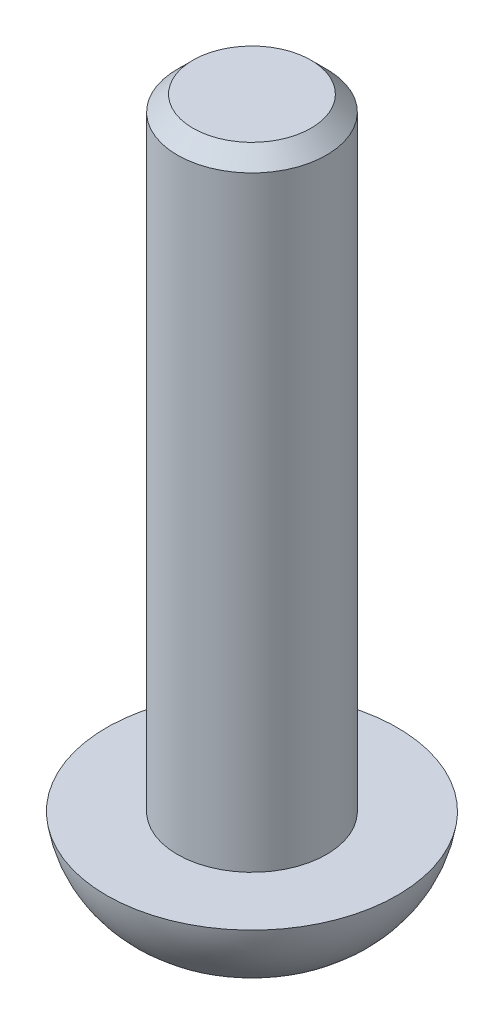
ISO-10303-21;
HEADER;
FILE_DESCRIPTION(('STEP AP214'),'2;1');
FILE_NAME('part.step','',(''),(''),'','','');
FILE_SCHEMA(('AUTOMOTIVE_DESIGN { 1 0 10303 214 1 1 1 1 }'));
ENDSEC;
DATA;
#1=APPLICATION_CONTEXT('core data for automotive mechanical design processes');
#2=APPLICATION_PROTOCOL_DEFINITION('international standard','automotive_design',2000,#1);
#3=PRODUCT_CONTEXT('',#1,'mechanical');
#4=PRODUCT('Part','Part','',(#3));
#5=PRODUCT_RELATED_PRODUCT_CATEGORY('part','',(#4));
#6=PRODUCT_DEFINITION_FORMATION('','',#4);
#7=PRODUCT_DEFINITION_CONTEXT('part definition',#1,'design');
#8=PRODUCT_DEFINITION('design','',#6,#7);
#9=PRODUCT_DEFINITION_SHAPE('','',#8);
#10=(LENGTH_UNIT() NAMED_UNIT(*) SI_UNIT(.MILLI.,.METRE.));
#11=(NAMED_UNIT(*) PLANE_ANGLE_UNIT() SI_UNIT($,.RADIAN.));
#12=(NAMED_UNIT(*) SI_UNIT($,.STERADIAN.) SOLID_ANGLE_UNIT());
#13=UNCERTAINTY_MEASURE_WITH_UNIT(LENGTH_MEASURE(1.E-05),#10,'distance_accuracy_value','');
#14=(GEOMETRIC_REPRESENTATION_CONTEXT(3) GLOBAL_UNCERTAINTY_ASSIGNED_CONTEXT((#13)) GLOBAL_UNIT_ASSIGNED_CONTEXT((#10,
#11,#12)) REPRESENTATION_CONTEXT('',''));
#15=CARTESIAN_POINT('',(0.,0.,0.));
#16=DIRECTION('',(0.,0.,1.));
#17=DIRECTION('',(1.,0.,0.));
#18=AXIS2_PLACEMENT_3D('',#15,#16,#17);
#19=CARTESIAN_POINT('',(0.,3.,0.));
#20=DIRECTION('',(0.,1.,0.));
#21=DIRECTION('',(0.,0.,1.));
#22=AXIS2_PLACEMENT_3D('',#19,#20,#21);
#23=PLANE('',#22);
#24=CARTESIAN_POINT('',(0.,3.,0.));
#25=DIRECTION('',(0.,1.,0.));
#26=DIRECTION('',(0.,0.,1.));
#27=AXIS2_PLACEMENT_3D('',#24,#25,#26);
#28=CIRCLE('',#27,2.4);
#29=CARTESIAN_POINT('',(0.,3.,2.4));
#30=VERTEX_POINT('',#29);
#31=EDGE_CURVE('E126',#30,#30,#28,.T.);
#32=ORIENTED_EDGE('',*,*,#31,.F.);
#33=EDGE_LOOP('',(#32));
#34=FACE_BOUND('',#33,.T.);
#35=CARTESIAN_POINT('',(0.,3.,0.));
#36=DIRECTION('',(0.,1.,0.));
#37=DIRECTION('',(0.,0.,1.));
#38=AXIS2_PLACEMENT_3D('',#35,#36,#37);
#39=CIRCLE('',#38,4.68);
#40=CARTESIAN_POINT('',(0.,3.,4.68));
#41=VERTEX_POINT('',#40);
#42=EDGE_CURVE('E138',#41,#41,#39,.T.);
#43=ORIENTED_EDGE('',*,*,#42,.T.);
#44=EDGE_LOOP('',(#43));
#45=FACE_BOUND('',#44,.T.);
#46=ADVANCED_FACE('F34',(#34,#45),#23,.T.);
#47=CARTESIAN_POINT('',(0.,3.,0.));
#48=DIRECTION('',(0.,1.,0.));
#49=DIRECTION('',(0.,0.,1.));
#50=AXIS2_PLACEMENT_3D('',#47,#48,#49);
#51=CYLINDRICAL_SURFACE('',#50,2.4);
#52=CARTESIAN_POINT('',(0.,22.5,0.));
#53=DIRECTION('',(0.,1.,0.));
#54=DIRECTION('',(0.,0.,1.));
#55=AXIS2_PLACEMENT_3D('',#52,#53,#54);
#56=CIRCLE('',#55,2.4);
#57=CARTESIAN_POINT('',(0.,22.5,2.4));
#58=VERTEX_POINT('',#57);
#59=EDGE_CURVE('E144',#58,#58,#56,.F.);
#60=ORIENTED_EDGE('',*,*,#59,.T.);
#61=EDGE_LOOP('',(#60));
#62=FACE_BOUND('',#61,.T.);
#63=ORIENTED_EDGE('',*,*,#31,.T.);
#64=EDGE_LOOP('',(#63));
#65=FACE_BOUND('',#64,.T.);
#66=ADVANCED_FACE('F175',(#62,#65),#51,.T.);
#67=CARTESIAN_POINT('',(0.,23.,0.));
#68=DIRECTION('',(0.,1.,0.));
#69=DIRECTION('',(0.,0.,1.));
#70=AXIS2_PLACEMENT_3D('',#67,#68,#69);
#71=PLANE('',#70);
#72=CARTESIAN_POINT('',(0.,23.,0.));
#73=DIRECTION('',(0.,1.,0.));
#74=DIRECTION('',(0.,0.,1.));
#75=AXIS2_PLACEMENT_3D('',#72,#73,#74);
#76=CIRCLE('',#75,1.9);
#77=CARTESIAN_POINT('',(0.,23.,1.9));
#78=VERTEX_POINT('',#77);
#79=EDGE_CURVE('E141',#78,#78,#76,.T.);
#80=ORIENTED_EDGE('',*,*,#79,.T.);
#81=EDGE_LOOP('',(#80));
#82=FACE_BOUND('',#81,.T.);
#83=ADVANCED_FACE('F206',(#82),#71,.T.);
#84=CARTESIAN_POINT('',(0.,23.,0.));
#85=DIRECTION('',(0.,-1.,0.));
#86=DIRECTION('',(0.,0.,-1.));
#87=AXIS2_PLACEMENT_3D('',#84,#85,#86);
#88=CONICAL_SURFACE('',#87,1.9,0.785398163397445);
#89=ORIENTED_EDGE('',*,*,#59,.F.);
#90=EDGE_LOOP('',(#89));
#91=FACE_BOUND('',#90,.T.);
#92=ORIENTED_EDGE('',*,*,#79,.F.);
#93=EDGE_LOOP('',(#92));
#94=FACE_BOUND('',#93,.T.);
#95=ADVANCED_FACE('F174',(#91,#94),#88,.T.);
#96=CARTESIAN_POINT('',(0.935307436087194,2.5,-1.62));
#97=DIRECTION('',(0.866025403784439,0.,-0.5));
#98=DIRECTION('',(-0.5,0.,-0.866025403784439));
#99=AXIS2_PLACEMENT_3D('',#96,#97,#98);
#100=PLANE('',#99);
#101=DIRECTION('',(0.,-1.,0.));
#102=VECTOR('',#101,1.);
#103=CARTESIAN_POINT('',(0.935307436087194,2.5,-1.62));
#104=LINE('',#103,#102);
#105=CARTESIAN_POINT('',(0.935307436087194,2.5,-1.62));
#106=VERTEX_POINT('',#105);
#107=CARTESIAN_POINT('',(0.935307436087194,0.0617815192687872,-1.62));
#108=VERTEX_POINT('',#107);
#109=EDGE_CURVE('E124',#106,#108,#104,.T.);
#110=ORIENTED_EDGE('',*,*,#109,.T.);
#111=CARTESIAN_POINT('',(0.935307436087194,0.0617815192687872,-1.62));
#112=CARTESIAN_POINT('',(0.974195463553861,0.0543833718086007,-1.5526439606216));
#113=CARTESIAN_POINT('',(1.01313994870139,0.0483391222089289,-1.48519013367146));
#114=CARTESIAN_POINT('',(1.09108807279113,0.0384835743096659,-1.35018002239335));
#115=CARTESIAN_POINT('',(1.13009168870199,0.0346715590583717,-1.28262377795684));
#116=CARTESIAN_POINT('',(1.20806450981189,0.0288063710982432,-1.14757089018501));
#117=CARTESIAN_POINT('',(1.24703366446266,0.0267502856976961,-1.08007433440187));
#118=CARTESIAN_POINT('',(1.32498892973964,0.0240502903275775,-0.945051854224628));
#119=CARTESIAN_POINT('',(1.36397504193522,0.0234065689754333,-0.877525927112314));
#120=CARTESIAN_POINT('',(1.44194726632636,0.0234065689754333,-0.742474072887686));
#121=CARTESIAN_POINT('',(1.48093337852194,0.0240502903275775,-0.674948145775372));
#122=CARTESIAN_POINT('',(1.55888864379892,0.0267502856976962,-0.539925665598129));
#123=CARTESIAN_POINT('',(1.59785779844969,0.0288063710982434,-0.472429109814986));
#124=CARTESIAN_POINT('',(1.67583061955959,0.0346715590583718,-0.33737622204316));
#125=CARTESIAN_POINT('',(1.71483423547045,0.0384835743096658,-0.269819977606651));
#126=CARTESIAN_POINT('',(1.79278235956019,0.0483391222089286,-0.134809866328539));
#127=CARTESIAN_POINT('',(1.83172684470772,0.0543833718086004,-0.0673560393783999));
#128=CARTESIAN_POINT('',(1.87061487217439,0.0617815192687874,0.));
#129=B_SPLINE_CURVE_WITH_KNOTS('',3,(#111,#112,#113,#114,#115,#116,#117,#118,#119,#120,#121,
#122,#123,#124,#125,#126,#127,#128),.UNSPECIFIED.,.F.,.F.,(4,2,2,2,2,2,2,2,4),(0.,
0.234346855618668,0.468618402091486,0.702500585883414,0.936414002112481,1.17032741834155,
1.40420960213348,1.6384811486063,1.87282800422496),.UNSPECIFIED.);
#130=CARTESIAN_POINT('',(1.87061487217439,0.0617815192687872,0.));
#131=VERTEX_POINT('',#130);
#132=EDGE_CURVE('E47',#108,#131,#129,.T.);
#133=ORIENTED_EDGE('',*,*,#132,.T.);
#134=DIRECTION('',(0.,-1.,0.));
#135=VECTOR('',#134,1.);
#136=CARTESIAN_POINT('',(1.87061487217439,2.5,0.));
#137=LINE('',#136,#135);
#138=CARTESIAN_POINT('',(1.87061487217439,2.5,0.));
#139=VERTEX_POINT('',#138);
#140=EDGE_CURVE('E92',#139,#131,#137,.T.);
#141=ORIENTED_EDGE('',*,*,#140,.F.);
#142=DIRECTION('',(0.5,0.,0.866025403784439));
#143=VECTOR('',#142,1.);
#144=CARTESIAN_POINT('',(0.935307436087194,2.5,-1.62));
#145=LINE('',#144,#143);
#146=EDGE_CURVE('E96',#106,#139,#145,.T.);
#147=ORIENTED_EDGE('',*,*,#146,.F.);
#148=EDGE_LOOP('',(#110,#133,#141,#147));
#149=FACE_BOUND('',#148,.T.);
#150=ADVANCED_FACE('F94',(#149),#100,.F.);
#151=CARTESIAN_POINT('',(-0.935307436087194,2.5,-1.62));
#152=DIRECTION('',(0.,0.,-1.));
#153=DIRECTION('',(-1.,0.,0.));
#154=AXIS2_PLACEMENT_3D('',#151,#152,#153);
#155=PLANE('',#154);
#156=DIRECTION('',(0.,-1.,0.));
#157=VECTOR('',#156,1.);
#158=CARTESIAN_POINT('',(-0.935307436087194,2.5,-1.62));
#159=LINE('',#158,#157);
#160=CARTESIAN_POINT('',(-0.935307436087194,2.5,-1.62));
#161=VERTEX_POINT('',#160);
#162=CARTESIAN_POINT('',(-0.935307436087194,0.0617815192687872,-1.62));
#163=VERTEX_POINT('',#162);
#164=EDGE_CURVE('E127',#161,#163,#159,.T.);
#165=ORIENTED_EDGE('',*,*,#164,.T.);
#166=CARTESIAN_POINT('',(-0.935307436087194,0.0617815192687872,-1.62));
#167=CARTESIAN_POINT('',(-0.857531381153861,0.0543833718086006,-1.62));
#168=CARTESIAN_POINT('',(-0.779642410858795,0.0483391222089289,-1.62));
#169=CARTESIAN_POINT('',(-0.623746162679316,0.0384835743096659,-1.62));
#170=CARTESIAN_POINT('',(-0.545738930857599,0.0346715590583716,-1.62));
#171=CARTESIAN_POINT('',(-0.389793288637799,0.0288063710982431,-1.62));
#172=CARTESIAN_POINT('',(-0.311854979336259,0.026750285697696,-1.62));
#173=CARTESIAN_POINT('',(-0.155944448782294,0.0240502903275773,-1.62));
#174=CARTESIAN_POINT('',(-0.0779722243911471,0.023406568975433,-1.62));
#175=CARTESIAN_POINT('',(0.0779722243911471,0.0234065689754332,-1.62));
#176=CARTESIAN_POINT('',(0.155944448782294,0.0240502903275777,-1.62));
#177=CARTESIAN_POINT('',(0.311854979336259,0.0267502856976964,-1.62));
#178=CARTESIAN_POINT('',(0.389793288637799,0.0288063710982432,-1.62));
#179=CARTESIAN_POINT('',(0.545738930857599,0.0346715590583715,-1.62));
#180=CARTESIAN_POINT('',(0.623746162679316,0.0384835743096658,-1.62));
#181=CARTESIAN_POINT('',(0.779642410858794,0.0483391222089289,-1.62));
#182=CARTESIAN_POINT('',(0.857531381153861,0.0543833718086007,-1.62));
#183=CARTESIAN_POINT('',(0.935307436087194,0.0617815192687871,-1.62));
#184=B_SPLINE_CURVE_WITH_KNOTS('',3,(#166,#167,#168,#169,#170,#171,#172,#173,#174,#175,#176,
#177,#178,#179,#180,#181,#182,#183),.UNSPECIFIED.,.F.,.F.,(4,2,2,2,2,2,2,2,4),(0.,
0.234346855618667,0.468618402091486,0.702500585883414,0.936414002112481,1.17032741834155,
1.40420960213348,1.6384811486063,1.87282800422496),.UNSPECIFIED.);
#185=EDGE_CURVE('E61',#163,#108,#184,.T.);
#186=ORIENTED_EDGE('',*,*,#185,.T.);
#187=ORIENTED_EDGE('',*,*,#109,.F.);
#188=DIRECTION('',(1.,0.,0.));
#189=VECTOR('',#188,1.);
#190=CARTESIAN_POINT('',(-0.935307436087194,2.5,-1.62));
#191=LINE('',#190,#189);
#192=EDGE_CURVE('E101',#161,#106,#191,.T.);
#193=ORIENTED_EDGE('',*,*,#192,.F.);
#194=EDGE_LOOP('',(#165,#186,#187,#193));
#195=FACE_BOUND('',#194,.T.);
#196=ADVANCED_FACE('F173',(#195),#155,.F.);
#197=CARTESIAN_POINT('',(-1.87061487217439,2.5,0.));
#198=DIRECTION('',(-0.866025403784439,0.,-0.5));
#199=DIRECTION('',(-0.5,0.,0.866025403784439));
#200=AXIS2_PLACEMENT_3D('',#197,#198,#199);
#201=PLANE('',#200);
#202=DIRECTION('',(0.,-1.,0.));
#203=VECTOR('',#202,1.);
#204=CARTESIAN_POINT('',(-1.87061487217439,2.5,0.));
#205=LINE('',#204,#203);
#206=CARTESIAN_POINT('',(-1.87061487217439,2.5,0.));
#207=VERTEX_POINT('',#206);
#208=CARTESIAN_POINT('',(-1.87061487217439,0.0617815192687872,0.));
#209=VERTEX_POINT('',#208);
#210=EDGE_CURVE('E129',#207,#209,#205,.T.);
#211=ORIENTED_EDGE('',*,*,#210,.T.);
#212=CARTESIAN_POINT('',(-1.87061487217439,0.0617815192687872,0.));
#213=CARTESIAN_POINT('',(-1.83172684470772,0.0543833718086006,-0.0673560393784007));
#214=CARTESIAN_POINT('',(-1.79278235956019,0.0483391222089288,-0.13480986632854));
#215=CARTESIAN_POINT('',(-1.71483423547045,0.0384835743096659,-0.269819977606651));
#216=CARTESIAN_POINT('',(-1.67583061955959,0.0346715590583716,-0.33737622204316));
#217=CARTESIAN_POINT('',(-1.59785779844969,0.0288063710982431,-0.472429109814987));
#218=CARTESIAN_POINT('',(-1.55888864379892,0.026750285697696,-0.539925665598129));
#219=CARTESIAN_POINT('',(-1.48093337852194,0.0240502903275774,-0.674948145775372));
#220=CARTESIAN_POINT('',(-1.44194726632636,0.0234065689754332,-0.742474072887686));
#221=CARTESIAN_POINT('',(-1.36397504193522,0.0234065689754332,-0.877525927112314));
#222=CARTESIAN_POINT('',(-1.32498892973964,0.0240502903275774,-0.945051854224628));
#223=CARTESIAN_POINT('',(-1.24703366446266,0.026750285697696,-1.08007433440187));
#224=CARTESIAN_POINT('',(-1.20806450981189,0.0288063710982432,-1.14757089018501));
#225=CARTESIAN_POINT('',(-1.13009168870199,0.0346715590583717,-1.28262377795684));
#226=CARTESIAN_POINT('',(-1.09108807279113,0.038483574309666,-1.35018002239335));
#227=CARTESIAN_POINT('',(-1.01313994870139,0.048339122208929,-1.48519013367146));
#228=CARTESIAN_POINT('',(-0.974195463553861,0.0543833718086008,-1.5526439606216));
#229=CARTESIAN_POINT('',(-0.935307436087194,0.0617815192687873,-1.62));
#230=B_SPLINE_CURVE_WITH_KNOTS('',3,(#212,#213,#214,#215,#216,#217,#218,#219,#220,#221,#222,
#223,#224,#225,#226,#227,#228,#229),.UNSPECIFIED.,.F.,.F.,(4,2,2,2,2,2,2,2,4),(0.,
0.234346855618667,0.468618402091485,0.702500585883414,0.936414002112481,1.17032741834155,
1.40420960213348,1.63848114860629,1.87282800422496),.UNSPECIFIED.);
#231=EDGE_CURVE('E186',#209,#163,#230,.T.);
#232=ORIENTED_EDGE('',*,*,#231,.T.);
#233=ORIENTED_EDGE('',*,*,#164,.F.);
#234=DIRECTION('',(0.5,0.,-0.866025403784439));
#235=VECTOR('',#234,1.);
#236=CARTESIAN_POINT('',(-1.87061487217439,2.5,0.));
#237=LINE('',#236,#235);
#238=EDGE_CURVE('E121',#207,#161,#237,.T.);
#239=ORIENTED_EDGE('',*,*,#238,.F.);
#240=EDGE_LOOP('',(#211,#232,#233,#239));
#241=FACE_BOUND('',#240,.T.);
#242=ADVANCED_FACE('F193',(#241),#201,.F.);
#243=CARTESIAN_POINT('',(-0.935307436087194,2.5,1.62));
#244=DIRECTION('',(-0.866025403784439,0.,0.5));
#245=DIRECTION('',(0.5,0.,0.866025403784439));
#246=AXIS2_PLACEMENT_3D('',#243,#244,#245);
#247=PLANE('',#246);
#248=DIRECTION('',(0.,-1.,0.));
#249=VECTOR('',#248,1.);
#250=CARTESIAN_POINT('',(-0.935307436087194,2.5,1.62));
#251=LINE('',#250,#249);
#252=CARTESIAN_POINT('',(-0.935307436087194,2.5,1.62));
#253=VERTEX_POINT('',#252);
#254=CARTESIAN_POINT('',(-0.935307436087194,0.0617815192687872,1.62));
#255=VERTEX_POINT('',#254);
#256=EDGE_CURVE('E132',#253,#255,#251,.T.);
#257=ORIENTED_EDGE('',*,*,#256,.T.);
#258=CARTESIAN_POINT('',(-0.935307436087194,0.0617815192687872,1.62));
#259=CARTESIAN_POINT('',(-0.974195463553861,0.0543833718086006,1.5526439606216));
#260=CARTESIAN_POINT('',(-1.01313994870139,0.0483391222089289,1.48519013367146));
#261=CARTESIAN_POINT('',(-1.09108807279113,0.0384835743096658,1.35018002239335));
#262=CARTESIAN_POINT('',(-1.13009168870199,0.0346715590583716,1.28262377795684));
#263=CARTESIAN_POINT('',(-1.20806450981189,0.0288063710982431,1.14757089018501));
#264=CARTESIAN_POINT('',(-1.24703366446266,0.026750285697696,1.08007433440187));
#265=CARTESIAN_POINT('',(-1.32498892973964,0.0240502903275773,0.945051854224628));
#266=CARTESIAN_POINT('',(-1.36397504193522,0.0234065689754332,0.877525927112314));
#267=CARTESIAN_POINT('',(-1.44194726632636,0.0234065689754332,0.742474072887686));
#268=CARTESIAN_POINT('',(-1.48093337852194,0.0240502903275773,0.674948145775371));
#269=CARTESIAN_POINT('',(-1.55888864379892,0.026750285697696,0.539925665598128));
#270=CARTESIAN_POINT('',(-1.59785779844969,0.0288063710982431,0.472429109814986));
#271=CARTESIAN_POINT('',(-1.67583061955959,0.0346715590583717,0.33737622204316));
#272=CARTESIAN_POINT('',(-1.71483423547045,0.0384835743096659,0.269819977606651));
#273=CARTESIAN_POINT('',(-1.79278235956019,0.0483391222089289,0.134809866328539));
#274=CARTESIAN_POINT('',(-1.83172684470772,0.0543833718086007,0.0673560393784001));
#275=CARTESIAN_POINT('',(-1.87061487217439,0.0617815192687872,0.));
#276=B_SPLINE_CURVE_WITH_KNOTS('',3,(#258,#259,#260,#261,#262,#263,#264,#265,#266,#267,#268,
#269,#270,#271,#272,#273,#274,#275),.UNSPECIFIED.,.F.,.F.,(4,2,2,2,2,2,2,2,4),(0.,
0.234346855618667,0.468618402091485,0.702500585883414,0.936414002112481,1.17032741834155,
1.40420960213348,1.6384811486063,1.87282800422496),.UNSPECIFIED.);
#277=EDGE_CURVE('E275',#255,#209,#276,.T.);
#278=ORIENTED_EDGE('',*,*,#277,.T.);
#279=ORIENTED_EDGE('',*,*,#210,.F.);
#280=DIRECTION('',(-0.5,0.,-0.866025403784439));
#281=VECTOR('',#280,1.);
#282=CARTESIAN_POINT('',(-0.935307436087194,2.5,1.62));
#283=LINE('',#282,#281);
#284=EDGE_CURVE('E118',#253,#207,#283,.T.);
#285=ORIENTED_EDGE('',*,*,#284,.F.);
#286=EDGE_LOOP('',(#257,#278,#279,#285));
#287=FACE_BOUND('',#286,.T.);
#288=ADVANCED_FACE('F162',(#287),#247,.F.);
#289=CARTESIAN_POINT('',(0.935307436087193,2.5,1.62));
#290=DIRECTION('',(0.,0.,1.));
#291=DIRECTION('',(1.,0.,0.));
#292=AXIS2_PLACEMENT_3D('',#289,#290,#291);
#293=PLANE('',#292);
#294=CARTESIAN_POINT('',(0.935307436087193,0.0617815192687872,1.62));
#295=CARTESIAN_POINT('',(0.859993195689798,0.0546139739732388,1.62));
#296=CARTESIAN_POINT('',(0.784571877400165,0.0487210802472018,1.62));
#297=CARTESIAN_POINT('',(0.633631470653708,0.0390445054310467,1.62));
#298=CARTESIAN_POINT('',(0.558112453693214,0.0352597260197356,1.62));
#299=CARTESIAN_POINT('',(0.407029286155618,0.0293533221932797,1.62));
#300=CARTESIAN_POINT('',(0.33146514747901,0.0272313685467345,1.62));
#301=CARTESIAN_POINT('',(0.180270640365965,0.0243678366561961,1.62));
#302=CARTESIAN_POINT('',(0.104640257908429,0.0236269751847356,1.62));
#303=CARTESIAN_POINT('',(0.0290129064890216,0.0234367741107168,1.62));
#304=B_SPLINE_CURVE_WITH_KNOTS('',3,(#294,#295,#296,#297,#298,#299,#300,#301,#302,#303),
.UNSPECIFIED.,.F.,.F.,(4,2,2,2,4),(0.,0.226932504884211,0.453746667763859,0.680515911189588,
0.907402812773406),.UNSPECIFIED.);
#305=CARTESIAN_POINT('',(0.935307436087193,0.0617815192687872,1.62));
#306=VERTEX_POINT('',#305);
#307=CARTESIAN_POINT('',(0.0290129064890167,0.0234367741107678,1.62));
#308=VERTEX_POINT('',#307);
#309=EDGE_CURVE('E147',#306,#308,#304,.T.);
#310=ORIENTED_EDGE('',*,*,#309,.T.);
#311=CARTESIAN_POINT('',(0.0290129064890167,0.0234367741107678,1.62));
#312=CARTESIAN_POINT('',(-0.0514512258165705,0.0233134233651439,1.62));
#313=CARTESIAN_POINT('',(-0.13192100630037,0.0237992581565071,1.62));
#314=CARTESIAN_POINT('',(-0.292790974225353,0.0262916923692295,1.62));
#315=CARTESIAN_POINT('',(-0.373191175401834,0.0282974399001469,1.62));
#316=CARTESIAN_POINT('',(-0.533949188344242,0.0341319257053814,1.62));
#317=CARTESIAN_POINT('',(-0.61430698669917,0.0379610694735424,1.62));
#318=CARTESIAN_POINT('',(-0.774918771597592,0.0479728188518649,1.62));
#319=CARTESIAN_POINT('',(-0.855172673937747,0.0541567517074734,1.62));
#320=CARTESIAN_POINT('',(-0.935307436087194,0.0617815192687873,1.62));
#321=B_SPLINE_CURVE_WITH_KNOTS('',3,(#311,#312,#313,#314,#315,#316,#317,#318,#319,#320),
.UNSPECIFIED.,.F.,.F.,(4,2,2,2,4),(0.,0.241396790450141,0.482658381260408,0.723973649821988,
0.965425134322768),.UNSPECIFIED.);
#322=EDGE_CURVE('E153',#308,#255,#321,.T.);
#323=ORIENTED_EDGE('',*,*,#322,.T.);
#324=ORIENTED_EDGE('',*,*,#256,.F.);
#325=DIRECTION('',(-1.,0.,0.));
#326=VECTOR('',#325,1.);
#327=CARTESIAN_POINT('',(0.935307436087193,2.5,1.62));
#328=LINE('',#327,#326);
#329=CARTESIAN_POINT('',(0.935307436087193,2.5,1.62));
#330=VERTEX_POINT('',#329);
#331=EDGE_CURVE('E110',#330,#253,#328,.T.);
#332=ORIENTED_EDGE('',*,*,#331,.F.);
#333=DIRECTION('',(0.,-1.,0.));
#334=VECTOR('',#333,1.);
#335=CARTESIAN_POINT('',(0.935307436087193,2.5,1.62));
#336=LINE('',#335,#334);
#337=EDGE_CURVE('E100',#330,#306,#336,.T.);
#338=ORIENTED_EDGE('',*,*,#337,.T.);
#339=EDGE_LOOP('',(#310,#323,#324,#332,#338));
#340=FACE_BOUND('',#339,.T.);
#341=ADVANCED_FACE('F158',(#340),#293,.F.);
#342=CARTESIAN_POINT('',(1.87061487217439,2.5,0.));
#343=DIRECTION('',(0.866025403784438,0.,0.5));
#344=DIRECTION('',(0.5,0.,-0.866025403784439));
#345=AXIS2_PLACEMENT_3D('',#342,#343,#344);
#346=PLANE('',#345);
#347=ORIENTED_EDGE('',*,*,#140,.T.);
#348=CARTESIAN_POINT('',(1.87061487217439,0.0617815192687872,0.));
#349=CARTESIAN_POINT('',(1.83172684470772,0.0543833718086006,0.067356039378401));
#350=CARTESIAN_POINT('',(1.79278235956019,0.0483391222089289,0.13480986632854));
#351=CARTESIAN_POINT('',(1.71483423547045,0.0384835743096659,0.269819977606651));
#352=CARTESIAN_POINT('',(1.67583061955959,0.0346715590583717,0.337376222043161));
#353=CARTESIAN_POINT('',(1.59785779844969,0.0288063710982431,0.472429109814986));
#354=CARTESIAN_POINT('',(1.55888864379892,0.026750285697696,0.539925665598129));
#355=CARTESIAN_POINT('',(1.48093337852194,0.0240502903275774,0.674948145775372));
#356=CARTESIAN_POINT('',(1.44194726632636,0.0234065689754332,0.742474072887686));
#357=CARTESIAN_POINT('',(1.36397504193522,0.0234065689754332,0.877525927112314));
#358=CARTESIAN_POINT('',(1.32498892973964,0.0240502903275774,0.945051854224628));
#359=CARTESIAN_POINT('',(1.24703366446266,0.0267502856976961,1.08007433440187));
#360=CARTESIAN_POINT('',(1.20806450981189,0.0288063710982434,1.14757089018501));
#361=CARTESIAN_POINT('',(1.13009168870199,0.0346715590583717,1.28262377795684));
#362=CARTESIAN_POINT('',(1.09108807279113,0.0384835743096658,1.35018002239335));
#363=CARTESIAN_POINT('',(1.01313994870139,0.0483391222089286,1.48519013367146));
#364=CARTESIAN_POINT('',(0.97419546355386,0.0543833718086004,1.5526439606216));
#365=CARTESIAN_POINT('',(0.935307436087193,0.0617815192687873,1.62));
#366=B_SPLINE_CURVE_WITH_KNOTS('',3,(#348,#349,#350,#351,#352,#353,#354,#355,#356,#357,#358,
#359,#360,#361,#362,#363,#364,#365),.UNSPECIFIED.,.F.,.F.,(4,2,2,2,2,2,2,2,4),(0.,
0.234346855618668,0.468618402091485,0.702500585883413,0.936414002112481,1.17032741834155,
1.40420960213348,1.63848114860629,1.87282800422496),.UNSPECIFIED.);
#367=EDGE_CURVE('E12',#131,#306,#366,.T.);
#368=ORIENTED_EDGE('',*,*,#367,.T.);
#369=ORIENTED_EDGE('',*,*,#337,.F.);
#370=DIRECTION('',(-0.5,0.,0.866025403784439));
#371=VECTOR('',#370,1.);
#372=CARTESIAN_POINT('',(1.87061487217439,2.5,0.));
#373=LINE('',#372,#371);
#374=EDGE_CURVE('E104',#139,#330,#373,.T.);
#375=ORIENTED_EDGE('',*,*,#374,.F.);
#376=EDGE_LOOP('',(#347,#368,#369,#375));
#377=FACE_BOUND('',#376,.T.);
#378=ADVANCED_FACE('F105',(#377),#346,.F.);
#379=CARTESIAN_POINT('',(0.,2.5,0.));
#380=DIRECTION('',(0.,-1.,0.));
#381=DIRECTION('',(0.,0.,-1.));
#382=AXIS2_PLACEMENT_3D('',#379,#380,#381);
#383=PLANE('',#382);
#384=ORIENTED_EDGE('',*,*,#146,.T.);
#385=ORIENTED_EDGE('',*,*,#374,.T.);
#386=ORIENTED_EDGE('',*,*,#331,.T.);
#387=ORIENTED_EDGE('',*,*,#284,.T.);
#388=ORIENTED_EDGE('',*,*,#238,.T.);
#389=ORIENTED_EDGE('',*,*,#192,.T.);
#390=EDGE_LOOP('',(#384,#385,#386,#387,#388,#389));
#391=FACE_BOUND('',#390,.T.);
#392=ADVANCED_FACE('F112',(#391),#383,.T.);
#393=CARTESIAN_POINT('',(0.,3.5,0.));
#394=DIRECTION('',(0.,-1.,0.));
#395=DIRECTION('',(0.,0.,-1.));
#396=AXIS2_PLACEMENT_3D('',#393,#394,#395);
#397=DEGENERATE_TOROIDAL_SURFACE('',#396,1.21589838486224,3.5,.T.);
#398=ORIENTED_EDGE('',*,*,#277,.F.);
#399=ORIENTED_EDGE('',*,*,#322,.F.);
#400=ORIENTED_EDGE('',*,*,#309,.F.);
#401=ORIENTED_EDGE('',*,*,#367,.F.);
#402=ORIENTED_EDGE('',*,*,#132,.F.);
#403=ORIENTED_EDGE('',*,*,#185,.F.);
#404=ORIENTED_EDGE('',*,*,#231,.F.);
#405=EDGE_LOOP('',(#398,#399,#400,#401,#402,#403,#404));
#406=FACE_BOUND('',#405,.T.);
#407=ORIENTED_EDGE('',*,*,#42,.F.);
#408=EDGE_LOOP('',(#407));
#409=FACE_BOUND('',#408,.T.);
#410=ADVANCED_FACE('F36',(#406,#409),#397,.T.);
#411=CLOSED_SHELL('',(#46,#66,#83,#95,#150,#196,#242,#288,#341,#378,#392,#410));
#412=MANIFOLD_SOLID_BREP('B2',#411);
#413=ADVANCED_BREP_SHAPE_REPRESENTATION('',(#18,#412),#14);
#414=SHAPE_DEFINITION_REPRESENTATION(#9,#413);
ENDSEC;
END-ISO-10303-21;
